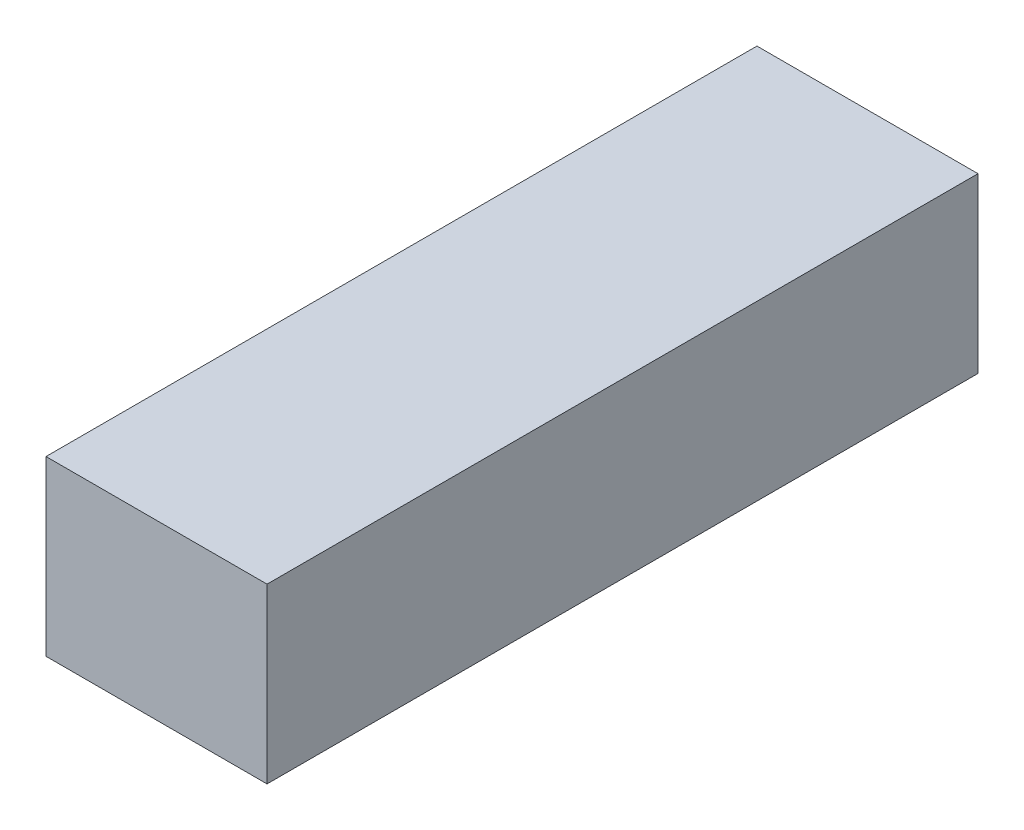
ISO-10303-21;
HEADER;
FILE_DESCRIPTION(('STEP AP214'),'2;1');
FILE_NAME('part.step','',(''),(''),'','','');
FILE_SCHEMA(('AUTOMOTIVE_DESIGN { 1 0 10303 214 1 1 1 1 }'));
ENDSEC;
DATA;
#1=APPLICATION_CONTEXT('core data for automotive mechanical design processes');
#2=APPLICATION_PROTOCOL_DEFINITION('international standard','automotive_design',2000,#1);
#3=PRODUCT_CONTEXT('',#1,'mechanical');
#4=PRODUCT('Part','Part','',(#3));
#5=PRODUCT_RELATED_PRODUCT_CATEGORY('part','',(#4));
#6=PRODUCT_DEFINITION_FORMATION('','',#4);
#7=PRODUCT_DEFINITION_CONTEXT('part definition',#1,'design');
#8=PRODUCT_DEFINITION('design','',#6,#7);
#9=PRODUCT_DEFINITION_SHAPE('','',#8);
#10=(LENGTH_UNIT() NAMED_UNIT(*) SI_UNIT(.MILLI.,.METRE.));
#11=(NAMED_UNIT(*) PLANE_ANGLE_UNIT() SI_UNIT($,.RADIAN.));
#12=(NAMED_UNIT(*) SI_UNIT($,.STERADIAN.) SOLID_ANGLE_UNIT());
#13=UNCERTAINTY_MEASURE_WITH_UNIT(LENGTH_MEASURE(1.E-05),#10,'distance_accuracy_value','');
#14=(GEOMETRIC_REPRESENTATION_CONTEXT(3) GLOBAL_UNCERTAINTY_ASSIGNED_CONTEXT((#13)) GLOBAL_UNIT_ASSIGNED_CONTEXT((#10,
#11,#12)) REPRESENTATION_CONTEXT('',''));
#15=CARTESIAN_POINT('',(0.,0.,0.));
#16=DIRECTION('',(0.,0.,1.));
#17=DIRECTION('',(1.,0.,0.));
#18=AXIS2_PLACEMENT_3D('',#15,#16,#17);
#19=CARTESIAN_POINT('',(-21.717,34.,-139.7));
#20=DIRECTION('',(1.,0.,0.));
#21=DIRECTION('',(0.,0.,-1.));
#22=AXIS2_PLACEMENT_3D('',#19,#20,#21);
#23=PLANE('',#22);
#24=DIRECTION('',(0.,0.,1.));
#25=VECTOR('',#24,1.);
#26=CARTESIAN_POINT('',(-21.717,0.,-139.7));
#27=LINE('',#26,#25);
#28=CARTESIAN_POINT('',(-21.717,0.,-139.7));
#29=VERTEX_POINT('',#28);
#30=CARTESIAN_POINT('',(-21.717,0.,0.));
#31=VERTEX_POINT('',#30);
#32=EDGE_CURVE('E100',#29,#31,#27,.T.);
#33=ORIENTED_EDGE('',*,*,#32,.T.);
#34=DIRECTION('',(0.,-1.,0.));
#35=VECTOR('',#34,1.);
#36=CARTESIAN_POINT('',(-21.717,34.,0.));
#37=LINE('',#36,#35);
#38=CARTESIAN_POINT('',(-21.717,34.,0.));
#39=VERTEX_POINT('',#38);
#40=EDGE_CURVE('E11',#39,#31,#37,.T.);
#41=ORIENTED_EDGE('',*,*,#40,.F.);
#42=DIRECTION('',(0.,0.,1.));
#43=VECTOR('',#42,1.);
#44=CARTESIAN_POINT('',(-21.717,34.,-139.7));
#45=LINE('',#44,#43);
#46=CARTESIAN_POINT('',(-21.717,34.,-139.7));
#47=VERTEX_POINT('',#46);
#48=EDGE_CURVE('E87',#47,#39,#45,.T.);
#49=ORIENTED_EDGE('',*,*,#48,.F.);
#50=DIRECTION('',(0.,-1.,0.));
#51=VECTOR('',#50,1.);
#52=CARTESIAN_POINT('',(-21.717,34.,-139.7));
#53=LINE('',#52,#51);
#54=EDGE_CURVE('E96',#47,#29,#53,.T.);
#55=ORIENTED_EDGE('',*,*,#54,.T.);
#56=EDGE_LOOP('',(#33,#41,#49,#55));
#57=FACE_BOUND('',#56,.T.);
#58=ADVANCED_FACE('F36',(#57),#23,.F.);
#59=CARTESIAN_POINT('',(-21.717,34.,0.));
#60=DIRECTION('',(0.,0.,-1.));
#61=DIRECTION('',(-1.,0.,0.));
#62=AXIS2_PLACEMENT_3D('',#59,#60,#61);
#63=PLANE('',#62);
#64=DIRECTION('',(1.,0.,0.));
#65=VECTOR('',#64,1.);
#66=CARTESIAN_POINT('',(-21.717,0.,0.));
#67=LINE('',#66,#65);
#68=CARTESIAN_POINT('',(21.717,0.,0.));
#69=VERTEX_POINT('',#68);
#70=EDGE_CURVE('E91',#31,#69,#67,.T.);
#71=ORIENTED_EDGE('',*,*,#70,.T.);
#72=DIRECTION('',(0.,-1.,0.));
#73=VECTOR('',#72,1.);
#74=CARTESIAN_POINT('',(21.717,34.,0.));
#75=LINE('',#74,#73);
#76=CARTESIAN_POINT('',(21.717,34.,0.));
#77=VERTEX_POINT('',#76);
#78=EDGE_CURVE('E44',#77,#69,#75,.T.);
#79=ORIENTED_EDGE('',*,*,#78,.F.);
#80=DIRECTION('',(1.,0.,0.));
#81=VECTOR('',#80,1.);
#82=CARTESIAN_POINT('',(-21.717,34.,0.));
#83=LINE('',#82,#81);
#84=EDGE_CURVE('E82',#39,#77,#83,.T.);
#85=ORIENTED_EDGE('',*,*,#84,.F.);
#86=ORIENTED_EDGE('',*,*,#40,.T.);
#87=EDGE_LOOP('',(#71,#79,#85,#86));
#88=FACE_BOUND('',#87,.T.);
#89=ADVANCED_FACE('F90',(#88),#63,.F.);
#90=CARTESIAN_POINT('',(21.717,34.,-139.7));
#91=DIRECTION('',(-1.,0.,0.));
#92=DIRECTION('',(0.,0.,1.));
#93=AXIS2_PLACEMENT_3D('',#90,#91,#92);
#94=PLANE('',#93);
#95=DIRECTION('',(0.,0.,-1.));
#96=VECTOR('',#95,1.);
#97=CARTESIAN_POINT('',(21.717,0.,-139.7));
#98=LINE('',#97,#96);
#99=CARTESIAN_POINT('',(21.717,0.,-139.7));
#100=VERTEX_POINT('',#99);
#101=EDGE_CURVE('E69',#69,#100,#98,.T.);
#102=ORIENTED_EDGE('',*,*,#101,.T.);
#103=DIRECTION('',(0.,-1.,0.));
#104=VECTOR('',#103,1.);
#105=CARTESIAN_POINT('',(21.717,34.,-139.7));
#106=LINE('',#105,#104);
#107=CARTESIAN_POINT('',(21.717,34.,-139.7));
#108=VERTEX_POINT('',#107);
#109=EDGE_CURVE('E92',#108,#100,#106,.T.);
#110=ORIENTED_EDGE('',*,*,#109,.F.);
#111=DIRECTION('',(0.,0.,-1.));
#112=VECTOR('',#111,1.);
#113=CARTESIAN_POINT('',(21.717,34.,-139.7));
#114=LINE('',#113,#112);
#115=EDGE_CURVE('E85',#77,#108,#114,.T.);
#116=ORIENTED_EDGE('',*,*,#115,.F.);
#117=ORIENTED_EDGE('',*,*,#78,.T.);
#118=EDGE_LOOP('',(#102,#110,#116,#117));
#119=FACE_BOUND('',#118,.T.);
#120=ADVANCED_FACE('F93',(#119),#94,.F.);
#121=CARTESIAN_POINT('',(-21.717,34.,-139.7));
#122=DIRECTION('',(0.,0.,1.));
#123=DIRECTION('',(1.,0.,0.));
#124=AXIS2_PLACEMENT_3D('',#121,#122,#123);
#125=PLANE('',#124);
#126=DIRECTION('',(-1.,0.,0.));
#127=VECTOR('',#126,1.);
#128=CARTESIAN_POINT('',(-21.717,0.,-139.7));
#129=LINE('',#128,#127);
#130=EDGE_CURVE('E75',#100,#29,#129,.T.);
#131=ORIENTED_EDGE('',*,*,#130,.T.);
#132=ORIENTED_EDGE('',*,*,#54,.F.);
#133=DIRECTION('',(-1.,0.,0.));
#134=VECTOR('',#133,1.);
#135=CARTESIAN_POINT('',(-21.717,34.,-139.7));
#136=LINE('',#135,#134);
#137=EDGE_CURVE('E52',#108,#47,#136,.T.);
#138=ORIENTED_EDGE('',*,*,#137,.F.);
#139=ORIENTED_EDGE('',*,*,#109,.T.);
#140=EDGE_LOOP('',(#131,#132,#138,#139));
#141=FACE_BOUND('',#140,.T.);
#142=ADVANCED_FACE('F108',(#141),#125,.F.);
#143=CARTESIAN_POINT('',(0.,34.,0.));
#144=DIRECTION('',(0.,1.,0.));
#145=DIRECTION('',(0.,0.,1.));
#146=AXIS2_PLACEMENT_3D('',#143,#144,#145);
#147=PLANE('',#146);
#148=ORIENTED_EDGE('',*,*,#48,.T.);
#149=ORIENTED_EDGE('',*,*,#84,.T.);
#150=ORIENTED_EDGE('',*,*,#115,.T.);
#151=ORIENTED_EDGE('',*,*,#137,.T.);
#152=EDGE_LOOP('',(#148,#149,#150,#151));
#153=FACE_BOUND('',#152,.T.);
#154=ADVANCED_FACE('F83',(#153),#147,.T.);
#155=CARTESIAN_POINT('',(0.,0.,0.));
#156=DIRECTION('',(0.,1.,0.));
#157=DIRECTION('',(0.,0.,1.));
#158=AXIS2_PLACEMENT_3D('',#155,#156,#157);
#159=PLANE('',#158);
#160=ORIENTED_EDGE('',*,*,#32,.F.);
#161=ORIENTED_EDGE('',*,*,#130,.F.);
#162=ORIENTED_EDGE('',*,*,#101,.F.);
#163=ORIENTED_EDGE('',*,*,#70,.F.);
#164=EDGE_LOOP('',(#160,#161,#162,#163));
#165=FACE_BOUND('',#164,.T.);
#166=ADVANCED_FACE('F111',(#165),#159,.F.);
#167=CLOSED_SHELL('',(#58,#89,#120,#142,#154,#166));
#168=MANIFOLD_SOLID_BREP('B2',#167);
#169=ADVANCED_BREP_SHAPE_REPRESENTATION('',(#18,#168),#14);
#170=SHAPE_DEFINITION_REPRESENTATION(#9,#169);
ENDSEC;
END-ISO-10303-21;
